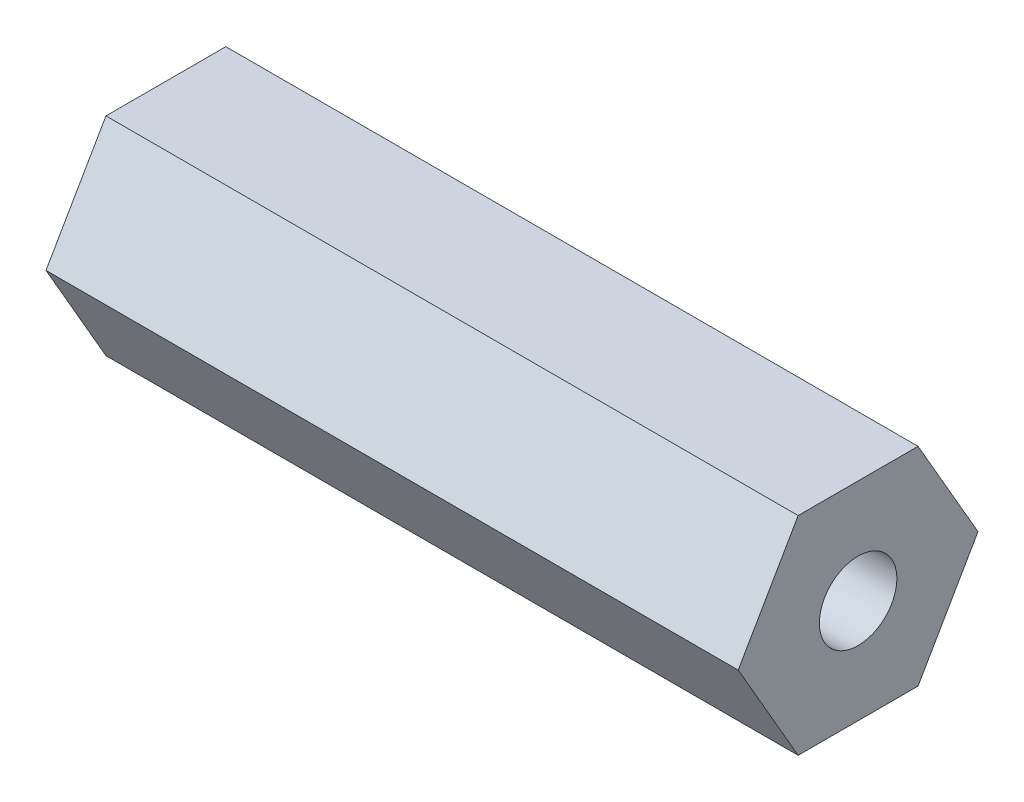
ISO-10303-21;
HEADER;
FILE_DESCRIPTION(('STEP AP214'),'2;1');
FILE_NAME('part.step','',(''),(''),'','','');
FILE_SCHEMA(('AUTOMOTIVE_DESIGN { 1 0 10303 214 1 1 1 1 }'));
ENDSEC;
DATA;
#1=APPLICATION_CONTEXT('core data for automotive mechanical design processes');
#2=APPLICATION_PROTOCOL_DEFINITION('international standard','automotive_design',2000,#1);
#3=PRODUCT_CONTEXT('',#1,'mechanical');
#4=PRODUCT('Part','Part','',(#3));
#5=PRODUCT_RELATED_PRODUCT_CATEGORY('part','',(#4));
#6=PRODUCT_DEFINITION_FORMATION('','',#4);
#7=PRODUCT_DEFINITION_CONTEXT('part definition',#1,'design');
#8=PRODUCT_DEFINITION('design','',#6,#7);
#9=PRODUCT_DEFINITION_SHAPE('','',#8);
#10=(LENGTH_UNIT() NAMED_UNIT(*) SI_UNIT(.MILLI.,.METRE.));
#11=(NAMED_UNIT(*) PLANE_ANGLE_UNIT() SI_UNIT($,.RADIAN.));
#12=(NAMED_UNIT(*) SI_UNIT($,.STERADIAN.) SOLID_ANGLE_UNIT());
#13=UNCERTAINTY_MEASURE_WITH_UNIT(LENGTH_MEASURE(1.E-05),#10,'distance_accuracy_value','');
#14=(GEOMETRIC_REPRESENTATION_CONTEXT(3) GLOBAL_UNCERTAINTY_ASSIGNED_CONTEXT((#13)) GLOBAL_UNIT_ASSIGNED_CONTEXT((#10,
#11,#12)) REPRESENTATION_CONTEXT('',''));
#15=CARTESIAN_POINT('',(0.,0.,0.));
#16=DIRECTION('',(0.,0.,1.));
#17=DIRECTION('',(1.,0.,0.));
#18=AXIS2_PLACEMENT_3D('',#15,#16,#17);
#19=CARTESIAN_POINT('',(15.875,0.,2.74963065701559));
#20=DIRECTION('',(0.,0.5,-0.866025403784438));
#21=DIRECTION('',(0.,0.866025403784439,0.5));
#22=AXIS2_PLACEMENT_3D('',#19,#20,#21);
#23=PLANE('',#22);
#24=DIRECTION('',(0.,-0.866025403784438,-0.5));
#25=VECTOR('',#24,1.);
#26=CARTESIAN_POINT('',(0.,0.,2.74963065701559));
#27=LINE('',#26,#25);
#28=CARTESIAN_POINT('',(0.,0.,2.74963065701559));
#29=VERTEX_POINT('',#28);
#30=CARTESIAN_POINT('',(0.,-2.38125,1.3748153285078));
#31=VERTEX_POINT('',#30);
#32=EDGE_CURVE('E119',#29,#31,#27,.T.);
#33=ORIENTED_EDGE('',*,*,#32,.T.);
#34=DIRECTION('',(-1.,0.,0.));
#35=VECTOR('',#34,1.);
#36=CARTESIAN_POINT('',(15.875,-2.38125,1.3748153285078));
#37=LINE('',#36,#35);
#38=CARTESIAN_POINT('',(15.875,-2.38125,1.3748153285078));
#39=VERTEX_POINT('',#38);
#40=EDGE_CURVE('E11',#39,#31,#37,.T.);
#41=ORIENTED_EDGE('',*,*,#40,.F.);
#42=DIRECTION('',(0.,-0.866025403784438,-0.5));
#43=VECTOR('',#42,1.);
#44=CARTESIAN_POINT('',(15.875,0.,2.74963065701559));
#45=LINE('',#44,#43);
#46=CARTESIAN_POINT('',(15.875,0.,2.74963065701559));
#47=VERTEX_POINT('',#46);
#48=EDGE_CURVE('E130',#47,#39,#45,.T.);
#49=ORIENTED_EDGE('',*,*,#48,.F.);
#50=DIRECTION('',(-1.,0.,0.));
#51=VECTOR('',#50,1.);
#52=CARTESIAN_POINT('',(15.875,0.,2.74963065701559));
#53=LINE('',#52,#51);
#54=EDGE_CURVE('E115',#47,#29,#53,.T.);
#55=ORIENTED_EDGE('',*,*,#54,.T.);
#56=EDGE_LOOP('',(#33,#41,#49,#55));
#57=FACE_BOUND('',#56,.T.);
#58=ADVANCED_FACE('F35',(#57),#23,.F.);
#59=CARTESIAN_POINT('',(15.875,-2.38125,1.3748153285078));
#60=DIRECTION('',(0.,1.,0.));
#61=DIRECTION('',(0.,0.,1.));
#62=AXIS2_PLACEMENT_3D('',#59,#60,#61);
#63=PLANE('',#62);
#64=DIRECTION('',(0.,0.,-1.));
#65=VECTOR('',#64,1.);
#66=CARTESIAN_POINT('',(0.,-2.38125,1.3748153285078));
#67=LINE('',#66,#65);
#68=CARTESIAN_POINT('',(0.,-2.38125,-1.3748153285078));
#69=VERTEX_POINT('',#68);
#70=EDGE_CURVE('E122',#31,#69,#67,.T.);
#71=ORIENTED_EDGE('',*,*,#70,.T.);
#72=DIRECTION('',(-1.,0.,0.));
#73=VECTOR('',#72,1.);
#74=CARTESIAN_POINT('',(15.875,-2.38125,-1.3748153285078));
#75=LINE('',#74,#73);
#76=CARTESIAN_POINT('',(15.875,-2.38125,-1.3748153285078));
#77=VERTEX_POINT('',#76);
#78=EDGE_CURVE('E43',#77,#69,#75,.T.);
#79=ORIENTED_EDGE('',*,*,#78,.F.);
#80=DIRECTION('',(0.,0.,-1.));
#81=VECTOR('',#80,1.);
#82=CARTESIAN_POINT('',(15.875,-2.38125,1.3748153285078));
#83=LINE('',#82,#81);
#84=EDGE_CURVE('E88',#39,#77,#83,.T.);
#85=ORIENTED_EDGE('',*,*,#84,.F.);
#86=ORIENTED_EDGE('',*,*,#40,.T.);
#87=EDGE_LOOP('',(#71,#79,#85,#86));
#88=FACE_BOUND('',#87,.T.);
#89=ADVANCED_FACE('F155',(#88),#63,.F.);
#90=CARTESIAN_POINT('',(15.875,-2.38125,-1.3748153285078));
#91=DIRECTION('',(0.,0.5,0.866025403784438));
#92=DIRECTION('',(0.,-0.866025403784439,0.5));
#93=AXIS2_PLACEMENT_3D('',#90,#91,#92);
#94=PLANE('',#93);
#95=DIRECTION('',(0.,0.866025403784439,-0.5));
#96=VECTOR('',#95,1.);
#97=CARTESIAN_POINT('',(0.,-2.38125,-1.3748153285078));
#98=LINE('',#97,#96);
#99=CARTESIAN_POINT('',(0.,0.,-2.74963065701559));
#100=VERTEX_POINT('',#99);
#101=EDGE_CURVE('E125',#69,#100,#98,.T.);
#102=ORIENTED_EDGE('',*,*,#101,.T.);
#103=DIRECTION('',(-1.,0.,0.));
#104=VECTOR('',#103,1.);
#105=CARTESIAN_POINT('',(15.875,0.,-2.74963065701559));
#106=LINE('',#105,#104);
#107=CARTESIAN_POINT('',(15.875,0.,-2.74963065701559));
#108=VERTEX_POINT('',#107);
#109=EDGE_CURVE('E110',#108,#100,#106,.T.);
#110=ORIENTED_EDGE('',*,*,#109,.F.);
#111=DIRECTION('',(0.,0.866025403784439,-0.5));
#112=VECTOR('',#111,1.);
#113=CARTESIAN_POINT('',(15.875,-2.38125,-1.3748153285078));
#114=LINE('',#113,#112);
#115=EDGE_CURVE('E101',#77,#108,#114,.T.);
#116=ORIENTED_EDGE('',*,*,#115,.F.);
#117=ORIENTED_EDGE('',*,*,#78,.T.);
#118=EDGE_LOOP('',(#102,#110,#116,#117));
#119=FACE_BOUND('',#118,.T.);
#120=ADVANCED_FACE('F136',(#119),#94,.F.);
#121=CARTESIAN_POINT('',(15.875,0.,-2.74963065701559));
#122=DIRECTION('',(0.,-0.5,0.866025403784438));
#123=DIRECTION('',(0.,-0.866025403784438,-0.5));
#124=AXIS2_PLACEMENT_3D('',#121,#122,#123);
#125=PLANE('',#124);
#126=DIRECTION('',(0.,0.866025403784438,0.5));
#127=VECTOR('',#126,1.);
#128=CARTESIAN_POINT('',(0.,0.,-2.74963065701559));
#129=LINE('',#128,#127);
#130=CARTESIAN_POINT('',(0.,2.38125,-1.37481532850779));
#131=VERTEX_POINT('',#130);
#132=EDGE_CURVE('E109',#100,#131,#129,.T.);
#133=ORIENTED_EDGE('',*,*,#132,.T.);
#134=DIRECTION('',(-1.,0.,0.));
#135=VECTOR('',#134,1.);
#136=CARTESIAN_POINT('',(15.875,2.38125,-1.37481532850779));
#137=LINE('',#136,#135);
#138=CARTESIAN_POINT('',(15.875,2.38125,-1.37481532850779));
#139=VERTEX_POINT('',#138);
#140=EDGE_CURVE('E106',#139,#131,#137,.T.);
#141=ORIENTED_EDGE('',*,*,#140,.F.);
#142=DIRECTION('',(0.,0.866025403784438,0.5));
#143=VECTOR('',#142,1.);
#144=CARTESIAN_POINT('',(15.875,0.,-2.74963065701559));
#145=LINE('',#144,#143);
#146=EDGE_CURVE('E95',#108,#139,#145,.T.);
#147=ORIENTED_EDGE('',*,*,#146,.F.);
#148=ORIENTED_EDGE('',*,*,#109,.T.);
#149=EDGE_LOOP('',(#133,#141,#147,#148));
#150=FACE_BOUND('',#149,.T.);
#151=ADVANCED_FACE('F107',(#150),#125,.F.);
#152=CARTESIAN_POINT('',(15.875,2.38125,-1.37481532850779));
#153=DIRECTION('',(0.,-1.,0.));
#154=DIRECTION('',(0.,0.,-1.));
#155=AXIS2_PLACEMENT_3D('',#152,#153,#154);
#156=PLANE('',#155);
#157=DIRECTION('',(0.,0.,1.));
#158=VECTOR('',#157,1.);
#159=CARTESIAN_POINT('',(0.,2.38125,-1.37481532850779));
#160=LINE('',#159,#158);
#161=CARTESIAN_POINT('',(0.,2.38125,1.3748153285078));
#162=VERTEX_POINT('',#161);
#163=EDGE_CURVE('E74',#131,#162,#160,.T.);
#164=ORIENTED_EDGE('',*,*,#163,.T.);
#165=DIRECTION('',(-1.,0.,0.));
#166=VECTOR('',#165,1.);
#167=CARTESIAN_POINT('',(15.875,2.38125,1.3748153285078));
#168=LINE('',#167,#166);
#169=CARTESIAN_POINT('',(15.875,2.38125,1.3748153285078));
#170=VERTEX_POINT('',#169);
#171=EDGE_CURVE('E111',#170,#162,#168,.T.);
#172=ORIENTED_EDGE('',*,*,#171,.F.);
#173=DIRECTION('',(0.,0.,1.));
#174=VECTOR('',#173,1.);
#175=CARTESIAN_POINT('',(15.875,2.38125,-1.37481532850779));
#176=LINE('',#175,#174);
#177=EDGE_CURVE('E99',#139,#170,#176,.T.);
#178=ORIENTED_EDGE('',*,*,#177,.F.);
#179=ORIENTED_EDGE('',*,*,#140,.T.);
#180=EDGE_LOOP('',(#164,#172,#178,#179));
#181=FACE_BOUND('',#180,.T.);
#182=ADVANCED_FACE('F113',(#181),#156,.F.);
#183=CARTESIAN_POINT('',(15.875,2.38125,1.3748153285078));
#184=DIRECTION('',(0.,-0.5,-0.866025403784439));
#185=DIRECTION('',(0.,0.866025403784439,-0.5));
#186=AXIS2_PLACEMENT_3D('',#183,#184,#185);
#187=PLANE('',#186);
#188=DIRECTION('',(0.,-0.866025403784439,0.5));
#189=VECTOR('',#188,1.);
#190=CARTESIAN_POINT('',(0.,2.38125,1.3748153285078));
#191=LINE('',#190,#189);
#192=EDGE_CURVE('E80',#162,#29,#191,.T.);
#193=ORIENTED_EDGE('',*,*,#192,.T.);
#194=ORIENTED_EDGE('',*,*,#54,.F.);
#195=DIRECTION('',(0.,-0.866025403784439,0.5));
#196=VECTOR('',#195,1.);
#197=CARTESIAN_POINT('',(15.875,2.38125,1.3748153285078));
#198=LINE('',#197,#196);
#199=EDGE_CURVE('E51',#170,#47,#198,.T.);
#200=ORIENTED_EDGE('',*,*,#199,.F.);
#201=ORIENTED_EDGE('',*,*,#171,.T.);
#202=EDGE_LOOP('',(#193,#194,#200,#201));
#203=FACE_BOUND('',#202,.T.);
#204=ADVANCED_FACE('F143',(#203),#187,.F.);
#205=CARTESIAN_POINT('',(15.875,0.,0.));
#206=DIRECTION('',(1.,0.,0.));
#207=DIRECTION('',(0.,0.,-1.));
#208=AXIS2_PLACEMENT_3D('',#205,#206,#207);
#209=PLANE('',#208);
#210=CARTESIAN_POINT('',(15.875,0.,0.));
#211=DIRECTION('',(-1.,0.,0.));
#212=DIRECTION('',(0.,0.,1.));
#213=AXIS2_PLACEMENT_3D('',#210,#211,#212);
#214=CIRCLE('',#213,0.888999999999996);
#215=CARTESIAN_POINT('',(15.875,0.,0.888999999999996));
#216=VERTEX_POINT('',#215);
#217=EDGE_CURVE('E123',#216,#216,#214,.T.);
#218=ORIENTED_EDGE('',*,*,#217,.T.);
#219=EDGE_LOOP('',(#218));
#220=FACE_BOUND('',#219,.T.);
#221=ORIENTED_EDGE('',*,*,#48,.T.);
#222=ORIENTED_EDGE('',*,*,#84,.T.);
#223=ORIENTED_EDGE('',*,*,#115,.T.);
#224=ORIENTED_EDGE('',*,*,#146,.T.);
#225=ORIENTED_EDGE('',*,*,#177,.T.);
#226=ORIENTED_EDGE('',*,*,#199,.T.);
#227=EDGE_LOOP('',(#221,#222,#223,#224,#225,#226));
#228=FACE_BOUND('',#227,.T.);
#229=ADVANCED_FACE('F97',(#220,#228),#209,.T.);
#230=CARTESIAN_POINT('',(0.,0.,0.));
#231=DIRECTION('',(1.,0.,0.));
#232=DIRECTION('',(0.,0.,-1.));
#233=AXIS2_PLACEMENT_3D('',#230,#231,#232);
#234=PLANE('',#233);
#235=CARTESIAN_POINT('',(0.,0.,0.));
#236=DIRECTION('',(-1.,0.,0.));
#237=DIRECTION('',(0.,0.,1.));
#238=AXIS2_PLACEMENT_3D('',#235,#236,#237);
#239=CIRCLE('',#238,0.888999999999987);
#240=CARTESIAN_POINT('',(0.,0.,0.888999999999987));
#241=VERTEX_POINT('',#240);
#242=EDGE_CURVE('E212',#241,#241,#239,.T.);
#243=ORIENTED_EDGE('',*,*,#242,.F.);
#244=EDGE_LOOP('',(#243));
#245=FACE_BOUND('',#244,.T.);
#246=ORIENTED_EDGE('',*,*,#32,.F.);
#247=ORIENTED_EDGE('',*,*,#192,.F.);
#248=ORIENTED_EDGE('',*,*,#163,.F.);
#249=ORIENTED_EDGE('',*,*,#132,.F.);
#250=ORIENTED_EDGE('',*,*,#101,.F.);
#251=ORIENTED_EDGE('',*,*,#70,.F.);
#252=EDGE_LOOP('',(#246,#247,#248,#249,#250,#251));
#253=FACE_BOUND('',#252,.T.);
#254=ADVANCED_FACE('F139',(#245,#253),#234,.F.);
#255=CARTESIAN_POINT('',(0.,0.,0.));
#256=DIRECTION('',(-1.,0.,0.));
#257=DIRECTION('',(0.,0.,1.));
#258=AXIS2_PLACEMENT_3D('',#255,#256,#257);
#259=CYLINDRICAL_SURFACE('',#258,0.888999999999991);
#260=ORIENTED_EDGE('',*,*,#217,.F.);
#261=EDGE_LOOP('',(#260));
#262=FACE_BOUND('',#261,.T.);
#263=ORIENTED_EDGE('',*,*,#242,.T.);
#264=EDGE_LOOP('',(#263));
#265=FACE_BOUND('',#264,.T.);
#266=ADVANCED_FACE('F192',(#262,#265),#259,.F.);
#267=CLOSED_SHELL('',(#58,#89,#120,#151,#182,#204,#229,#254,#266));
#268=MANIFOLD_SOLID_BREP('B2',#267);
#269=ADVANCED_BREP_SHAPE_REPRESENTATION('',(#18,#268),#14);
#270=SHAPE_DEFINITION_REPRESENTATION(#9,#269);
ENDSEC;
END-ISO-10303-21;
